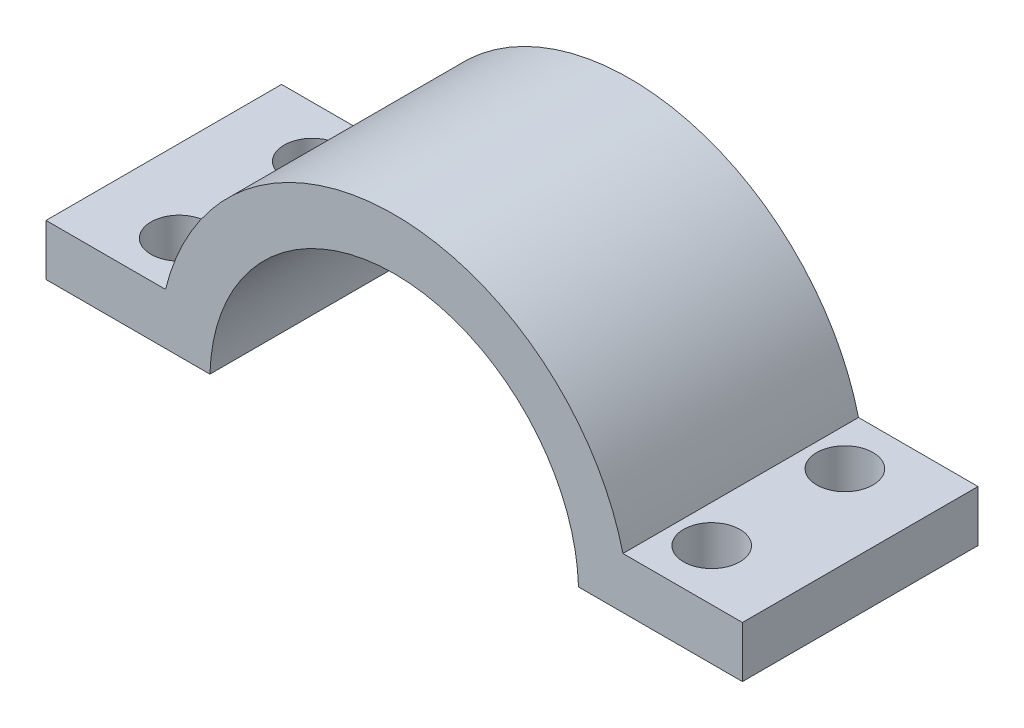
ISO-10303-21;
HEADER;
FILE_DESCRIPTION(('STEP AP214'),'2;1');
FILE_NAME('part.step','',(''),(''),'','','');
FILE_SCHEMA(('AUTOMOTIVE_DESIGN { 1 0 10303 214 1 1 1 1 }'));
ENDSEC;
DATA;
#1=APPLICATION_CONTEXT('core data for automotive mechanical design processes');
#2=APPLICATION_PROTOCOL_DEFINITION('international standard','automotive_design',2000,#1);
#3=PRODUCT_CONTEXT('',#1,'mechanical');
#4=PRODUCT('Part','Part','',(#3));
#5=PRODUCT_RELATED_PRODUCT_CATEGORY('part','',(#4));
#6=PRODUCT_DEFINITION_FORMATION('','',#4);
#7=PRODUCT_DEFINITION_CONTEXT('part definition',#1,'design');
#8=PRODUCT_DEFINITION('design','',#6,#7);
#9=PRODUCT_DEFINITION_SHAPE('','',#8);
#10=(LENGTH_UNIT() NAMED_UNIT(*) SI_UNIT(.MILLI.,.METRE.));
#11=(NAMED_UNIT(*) PLANE_ANGLE_UNIT() SI_UNIT($,.RADIAN.));
#12=(NAMED_UNIT(*) SI_UNIT($,.STERADIAN.) SOLID_ANGLE_UNIT());
#13=UNCERTAINTY_MEASURE_WITH_UNIT(LENGTH_MEASURE(1.E-05),#10,'distance_accuracy_value','');
#14=(GEOMETRIC_REPRESENTATION_CONTEXT(3) GLOBAL_UNCERTAINTY_ASSIGNED_CONTEXT((#13)) GLOBAL_UNIT_ASSIGNED_CONTEXT((#10,
#11,#12)) REPRESENTATION_CONTEXT('',''));
#15=CARTESIAN_POINT('',(0.,0.,0.));
#16=DIRECTION('',(0.,0.,1.));
#17=DIRECTION('',(1.,0.,0.));
#18=AXIS2_PLACEMENT_3D('',#15,#16,#17);
#19=CARTESIAN_POINT('',(0.,0.,23.));
#20=DIRECTION('',(0.,0.,-1.));
#21=DIRECTION('',(-1.,0.,0.));
#22=AXIS2_PLACEMENT_3D('',#19,#20,#21);
#23=CYLINDRICAL_SURFACE('',#22,18.);
#24=CARTESIAN_POINT('',(0.,0.,0.));
#25=DIRECTION('',(0.,0.,-1.));
#26=DIRECTION('',(1.,0.,0.));
#27=AXIS2_PLACEMENT_3D('',#24,#25,#26);
#28=CIRCLE('',#27,18.);
#29=CARTESIAN_POINT('',(-17.9930542154466,0.500000000000002,0.));
#30=VERTEX_POINT('',#29);
#31=CARTESIAN_POINT('',(17.9930542154466,0.500000000000002,0.));
#32=VERTEX_POINT('',#31);
#33=EDGE_CURVE('E131',#30,#32,#28,.T.);
#34=ORIENTED_EDGE('',*,*,#33,.T.);
#35=DIRECTION('',(0.,0.,-1.));
#36=VECTOR('',#35,1.);
#37=CARTESIAN_POINT('',(17.9930542154466,0.500000000000002,23.));
#38=LINE('',#37,#36);
#39=CARTESIAN_POINT('',(17.9930542154466,0.500000000000002,23.));
#40=VERTEX_POINT('',#39);
#41=EDGE_CURVE('E11',#40,#32,#38,.T.);
#42=ORIENTED_EDGE('',*,*,#41,.F.);
#43=CARTESIAN_POINT('',(0.,0.,23.));
#44=DIRECTION('',(0.,0.,-1.));
#45=DIRECTION('',(1.,0.,0.));
#46=AXIS2_PLACEMENT_3D('',#43,#44,#45);
#47=CIRCLE('',#46,18.);
#48=CARTESIAN_POINT('',(-17.9930542154466,0.500000000000002,23.));
#49=VERTEX_POINT('',#48);
#50=EDGE_CURVE('E145',#49,#40,#47,.T.);
#51=ORIENTED_EDGE('',*,*,#50,.F.);
#52=DIRECTION('',(0.,0.,-1.));
#53=VECTOR('',#52,1.);
#54=CARTESIAN_POINT('',(-17.9930542154466,0.500000000000002,23.));
#55=LINE('',#54,#53);
#56=EDGE_CURVE('E127',#49,#30,#55,.T.);
#57=ORIENTED_EDGE('',*,*,#56,.T.);
#58=EDGE_LOOP('',(#34,#42,#51,#57));
#59=FACE_BOUND('',#58,.T.);
#60=ADVANCED_FACE('F33',(#59),#23,.F.);
#61=CARTESIAN_POINT('',(17.9930542154466,0.500000000000002,23.));
#62=DIRECTION('',(0.,1.,0.));
#63=DIRECTION('',(-1.,0.,0.));
#64=AXIS2_PLACEMENT_3D('',#61,#62,#63);
#65=PLANE('',#64);
#66=CARTESIAN_POINT('',(26.,0.50000000000002,18.));
#67=DIRECTION('',(0.,-1.,0.));
#68=DIRECTION('',(1.,0.,0.));
#69=AXIS2_PLACEMENT_3D('',#66,#67,#68);
#70=CIRCLE('',#69,2.75);
#71=CARTESIAN_POINT('',(28.75,0.500000000000021,18.));
#72=VERTEX_POINT('',#71);
#73=EDGE_CURVE('E260',#72,#72,#70,.T.);
#74=ORIENTED_EDGE('',*,*,#73,.F.);
#75=EDGE_LOOP('',(#74));
#76=FACE_BOUND('',#75,.T.);
#77=CARTESIAN_POINT('',(26.,0.50000000000002,5.));
#78=DIRECTION('',(0.,-1.,0.));
#79=DIRECTION('',(1.,0.,0.));
#80=AXIS2_PLACEMENT_3D('',#77,#78,#79);
#81=CIRCLE('',#80,2.75);
#82=CARTESIAN_POINT('',(28.75,0.500000000000021,5.));
#83=VERTEX_POINT('',#82);
#84=EDGE_CURVE('E258',#83,#83,#81,.T.);
#85=ORIENTED_EDGE('',*,*,#84,.F.);
#86=EDGE_LOOP('',(#85));
#87=FACE_BOUND('',#86,.T.);
#88=DIRECTION('',(1.,0.,0.));
#89=VECTOR('',#88,1.);
#90=CARTESIAN_POINT('',(17.9930542154466,0.500000000000002,0.));
#91=LINE('',#90,#89);
#92=CARTESIAN_POINT('',(34.,0.500000000000002,0.));
#93=VERTEX_POINT('',#92);
#94=EDGE_CURVE('E134',#32,#93,#91,.T.);
#95=ORIENTED_EDGE('',*,*,#94,.T.);
#96=DIRECTION('',(0.,0.,-1.));
#97=VECTOR('',#96,1.);
#98=CARTESIAN_POINT('',(34.,0.500000000000002,23.));
#99=LINE('',#98,#97);
#100=CARTESIAN_POINT('',(34.,0.500000000000002,23.));
#101=VERTEX_POINT('',#100);
#102=EDGE_CURVE('E42',#101,#93,#99,.T.);
#103=ORIENTED_EDGE('',*,*,#102,.F.);
#104=DIRECTION('',(1.,0.,0.));
#105=VECTOR('',#104,1.);
#106=CARTESIAN_POINT('',(17.9930542154466,0.500000000000002,23.));
#107=LINE('',#106,#105);
#108=EDGE_CURVE('E94',#40,#101,#107,.T.);
#109=ORIENTED_EDGE('',*,*,#108,.F.);
#110=ORIENTED_EDGE('',*,*,#41,.T.);
#111=EDGE_LOOP('',(#95,#103,#109,#110));
#112=FACE_BOUND('',#111,.T.);
#113=ADVANCED_FACE('F208',(#76,#87,#112),#65,.F.);
#114=CARTESIAN_POINT('',(34.,0.500000000000002,23.));
#115=DIRECTION('',(-1.,0.,0.));
#116=DIRECTION('',(0.,0.,1.));
#117=AXIS2_PLACEMENT_3D('',#114,#115,#116);
#118=PLANE('',#117);
#119=DIRECTION('',(0.,1.,0.));
#120=VECTOR('',#119,1.);
#121=CARTESIAN_POINT('',(34.,0.500000000000002,0.));
#122=LINE('',#121,#120);
#123=CARTESIAN_POINT('',(34.,5.5,0.));
#124=VERTEX_POINT('',#123);
#125=EDGE_CURVE('E136',#93,#124,#122,.T.);
#126=ORIENTED_EDGE('',*,*,#125,.T.);
#127=DIRECTION('',(0.,0.,-1.));
#128=VECTOR('',#127,1.);
#129=CARTESIAN_POINT('',(34.,5.5,23.));
#130=LINE('',#129,#128);
#131=CARTESIAN_POINT('',(34.,5.5,23.));
#132=VERTEX_POINT('',#131);
#133=EDGE_CURVE('E152',#132,#124,#130,.T.);
#134=ORIENTED_EDGE('',*,*,#133,.F.);
#135=DIRECTION('',(0.,1.,0.));
#136=VECTOR('',#135,1.);
#137=CARTESIAN_POINT('',(34.,0.500000000000002,23.));
#138=LINE('',#137,#136);
#139=EDGE_CURVE('E174',#101,#132,#138,.T.);
#140=ORIENTED_EDGE('',*,*,#139,.F.);
#141=ORIENTED_EDGE('',*,*,#102,.T.);
#142=EDGE_LOOP('',(#126,#134,#140,#141));
#143=FACE_BOUND('',#142,.T.);
#144=ADVANCED_FACE('F212',(#143),#118,.F.);
#145=CARTESIAN_POINT('',(34.,5.5,23.));
#146=DIRECTION('',(0.,-1.,0.));
#147=DIRECTION('',(1.,0.,0.));
#148=AXIS2_PLACEMENT_3D('',#145,#146,#147);
#149=PLANE('',#148);
#150=CARTESIAN_POINT('',(26.,5.5,18.));
#151=DIRECTION('',(0.,-1.,0.));
#152=DIRECTION('',(1.,0.,0.));
#153=AXIS2_PLACEMENT_3D('',#150,#151,#152);
#154=CIRCLE('',#153,2.75);
#155=CARTESIAN_POINT('',(28.75,5.5,18.));
#156=VERTEX_POINT('',#155);
#157=EDGE_CURVE('E36',#156,#156,#154,.T.);
#158=ORIENTED_EDGE('',*,*,#157,.T.);
#159=EDGE_LOOP('',(#158));
#160=FACE_BOUND('',#159,.T.);
#161=CARTESIAN_POINT('',(26.,5.5,5.));
#162=DIRECTION('',(0.,-1.,0.));
#163=DIRECTION('',(1.,0.,0.));
#164=AXIS2_PLACEMENT_3D('',#161,#162,#163);
#165=CIRCLE('',#164,2.75);
#166=CARTESIAN_POINT('',(28.75,5.5,5.));
#167=VERTEX_POINT('',#166);
#168=EDGE_CURVE('E156',#167,#167,#165,.T.);
#169=ORIENTED_EDGE('',*,*,#168,.T.);
#170=EDGE_LOOP('',(#169));
#171=FACE_BOUND('',#170,.T.);
#172=DIRECTION('',(-1.,0.,0.));
#173=VECTOR('',#172,1.);
#174=CARTESIAN_POINT('',(34.,5.5,0.));
#175=LINE('',#174,#173);
#176=CARTESIAN_POINT('',(22.3327114341273,5.5,0.));
#177=VERTEX_POINT('',#176);
#178=EDGE_CURVE('E138',#124,#177,#175,.T.);
#179=ORIENTED_EDGE('',*,*,#178,.T.);
#180=DIRECTION('',(0.,0.,-1.));
#181=VECTOR('',#180,1.);
#182=CARTESIAN_POINT('',(22.3327114341273,5.5,23.));
#183=LINE('',#182,#181);
#184=CARTESIAN_POINT('',(22.3327114341273,5.5,23.));
#185=VERTEX_POINT('',#184);
#186=EDGE_CURVE('E149',#185,#177,#183,.T.);
#187=ORIENTED_EDGE('',*,*,#186,.F.);
#188=DIRECTION('',(-1.,0.,0.));
#189=VECTOR('',#188,1.);
#190=CARTESIAN_POINT('',(34.,5.5,23.));
#191=LINE('',#190,#189);
#192=EDGE_CURVE('E176',#132,#185,#191,.T.);
#193=ORIENTED_EDGE('',*,*,#192,.F.);
#194=ORIENTED_EDGE('',*,*,#133,.T.);
#195=EDGE_LOOP('',(#179,#187,#193,#194));
#196=FACE_BOUND('',#195,.T.);
#197=ADVANCED_FACE('F182',(#160,#171,#196),#149,.F.);
#198=CARTESIAN_POINT('',(0.,0.,23.));
#199=DIRECTION('',(0.,0.,-1.));
#200=DIRECTION('',(-1.,0.,0.));
#201=AXIS2_PLACEMENT_3D('',#198,#199,#200);
#202=CYLINDRICAL_SURFACE('',#201,23.);
#203=CARTESIAN_POINT('',(0.,0.,0.));
#204=DIRECTION('',(0.,0.,1.));
#205=DIRECTION('',(1.,0.,0.));
#206=AXIS2_PLACEMENT_3D('',#203,#204,#205);
#207=CIRCLE('',#206,23.);
#208=CARTESIAN_POINT('',(-22.3327114341273,5.5,0.));
#209=VERTEX_POINT('',#208);
#210=EDGE_CURVE('E140',#177,#209,#207,.T.);
#211=ORIENTED_EDGE('',*,*,#210,.T.);
#212=DIRECTION('',(0.,0.,-1.));
#213=VECTOR('',#212,1.);
#214=CARTESIAN_POINT('',(-22.3327114341273,5.5,23.));
#215=LINE('',#214,#213);
#216=CARTESIAN_POINT('',(-22.3327114341273,5.5,23.));
#217=VERTEX_POINT('',#216);
#218=EDGE_CURVE('E122',#217,#209,#215,.T.);
#219=ORIENTED_EDGE('',*,*,#218,.F.);
#220=CARTESIAN_POINT('',(0.,0.,23.));
#221=DIRECTION('',(0.,0.,1.));
#222=DIRECTION('',(1.,0.,0.));
#223=AXIS2_PLACEMENT_3D('',#220,#221,#222);
#224=CIRCLE('',#223,23.);
#225=EDGE_CURVE('E113',#185,#217,#224,.T.);
#226=ORIENTED_EDGE('',*,*,#225,.F.);
#227=ORIENTED_EDGE('',*,*,#186,.T.);
#228=EDGE_LOOP('',(#211,#219,#226,#227));
#229=FACE_BOUND('',#228,.T.);
#230=ADVANCED_FACE('F186',(#229),#202,.T.);
#231=CARTESIAN_POINT('',(-34.,5.5,23.));
#232=DIRECTION('',(0.,-1.,0.));
#233=DIRECTION('',(0.,0.,-1.));
#234=AXIS2_PLACEMENT_3D('',#231,#232,#233);
#235=PLANE('',#234);
#236=CARTESIAN_POINT('',(-26.,5.5,5.));
#237=DIRECTION('',(0.,-1.,0.));
#238=DIRECTION('',(0.,0.,-1.));
#239=AXIS2_PLACEMENT_3D('',#236,#237,#238);
#240=CIRCLE('',#239,2.75);
#241=CARTESIAN_POINT('',(-26.,5.5,2.25));
#242=VERTEX_POINT('',#241);
#243=EDGE_CURVE('E158',#242,#242,#240,.T.);
#244=ORIENTED_EDGE('',*,*,#243,.T.);
#245=EDGE_LOOP('',(#244));
#246=FACE_BOUND('',#245,.T.);
#247=CARTESIAN_POINT('',(-26.,5.5,18.));
#248=DIRECTION('',(0.,-1.,0.));
#249=DIRECTION('',(0.,0.,-1.));
#250=AXIS2_PLACEMENT_3D('',#247,#248,#249);
#251=CIRCLE('',#250,2.75);
#252=CARTESIAN_POINT('',(-26.,5.5,15.25));
#253=VERTEX_POINT('',#252);
#254=EDGE_CURVE('E163',#253,#253,#251,.T.);
#255=ORIENTED_EDGE('',*,*,#254,.T.);
#256=EDGE_LOOP('',(#255));
#257=FACE_BOUND('',#256,.T.);
#258=DIRECTION('',(-1.,0.,0.));
#259=VECTOR('',#258,1.);
#260=CARTESIAN_POINT('',(-34.,5.5,0.));
#261=LINE('',#260,#259);
#262=CARTESIAN_POINT('',(-34.,5.5,0.));
#263=VERTEX_POINT('',#262);
#264=EDGE_CURVE('E121',#209,#263,#261,.T.);
#265=ORIENTED_EDGE('',*,*,#264,.T.);
#266=DIRECTION('',(0.,0.,-1.));
#267=VECTOR('',#266,1.);
#268=CARTESIAN_POINT('',(-34.,5.5,23.));
#269=LINE('',#268,#267);
#270=CARTESIAN_POINT('',(-34.,5.5,23.));
#271=VERTEX_POINT('',#270);
#272=EDGE_CURVE('E118',#271,#263,#269,.T.);
#273=ORIENTED_EDGE('',*,*,#272,.F.);
#274=DIRECTION('',(-1.,0.,0.));
#275=VECTOR('',#274,1.);
#276=CARTESIAN_POINT('',(-34.,5.5,23.));
#277=LINE('',#276,#275);
#278=EDGE_CURVE('E107',#217,#271,#277,.T.);
#279=ORIENTED_EDGE('',*,*,#278,.F.);
#280=ORIENTED_EDGE('',*,*,#218,.T.);
#281=EDGE_LOOP('',(#265,#273,#279,#280));
#282=FACE_BOUND('',#281,.T.);
#283=ADVANCED_FACE('F119',(#246,#257,#282),#235,.F.);
#284=CARTESIAN_POINT('',(-34.,0.499999999999996,23.));
#285=DIRECTION('',(1.,0.,0.));
#286=DIRECTION('',(0.,0.,-1.));
#287=AXIS2_PLACEMENT_3D('',#284,#285,#286);
#288=PLANE('',#287);
#289=DIRECTION('',(0.,-1.,0.));
#290=VECTOR('',#289,1.);
#291=CARTESIAN_POINT('',(-34.,0.499999999999996,0.));
#292=LINE('',#291,#290);
#293=CARTESIAN_POINT('',(-34.,0.499999999999996,0.));
#294=VERTEX_POINT('',#293);
#295=EDGE_CURVE('E80',#263,#294,#292,.T.);
#296=ORIENTED_EDGE('',*,*,#295,.T.);
#297=DIRECTION('',(0.,0.,-1.));
#298=VECTOR('',#297,1.);
#299=CARTESIAN_POINT('',(-34.,0.499999999999996,23.));
#300=LINE('',#299,#298);
#301=CARTESIAN_POINT('',(-34.,0.499999999999996,23.));
#302=VERTEX_POINT('',#301);
#303=EDGE_CURVE('E123',#302,#294,#300,.T.);
#304=ORIENTED_EDGE('',*,*,#303,.F.);
#305=DIRECTION('',(0.,-1.,0.));
#306=VECTOR('',#305,1.);
#307=CARTESIAN_POINT('',(-34.,0.499999999999996,23.));
#308=LINE('',#307,#306);
#309=EDGE_CURVE('E111',#271,#302,#308,.T.);
#310=ORIENTED_EDGE('',*,*,#309,.F.);
#311=ORIENTED_EDGE('',*,*,#272,.T.);
#312=EDGE_LOOP('',(#296,#304,#310,#311));
#313=FACE_BOUND('',#312,.T.);
#314=ADVANCED_FACE('F125',(#313),#288,.F.);
#315=CARTESIAN_POINT('',(-17.9930542154466,0.500000000000002,23.));
#316=DIRECTION('',(0.,1.,0.));
#317=DIRECTION('',(-1.,0.,0.));
#318=AXIS2_PLACEMENT_3D('',#315,#316,#317);
#319=PLANE('',#318);
#320=CARTESIAN_POINT('',(-26.,0.499999999999999,5.));
#321=DIRECTION('',(0.,-1.,0.));
#322=DIRECTION('',(1.,0.,0.));
#323=AXIS2_PLACEMENT_3D('',#320,#321,#322);
#324=CIRCLE('',#323,2.75);
#325=CARTESIAN_POINT('',(-23.25,0.5,5.));
#326=VERTEX_POINT('',#325);
#327=EDGE_CURVE('E259',#326,#326,#324,.T.);
#328=ORIENTED_EDGE('',*,*,#327,.F.);
#329=EDGE_LOOP('',(#328));
#330=FACE_BOUND('',#329,.T.);
#331=CARTESIAN_POINT('',(-26.,0.499999999999999,18.));
#332=DIRECTION('',(0.,-1.,0.));
#333=DIRECTION('',(1.,0.,0.));
#334=AXIS2_PLACEMENT_3D('',#331,#332,#333);
#335=CIRCLE('',#334,2.75);
#336=CARTESIAN_POINT('',(-23.25,0.5,18.));
#337=VERTEX_POINT('',#336);
#338=EDGE_CURVE('E168',#337,#337,#335,.T.);
#339=ORIENTED_EDGE('',*,*,#338,.F.);
#340=EDGE_LOOP('',(#339));
#341=FACE_BOUND('',#340,.T.);
#342=DIRECTION('',(1.,0.,0.));
#343=VECTOR('',#342,1.);
#344=CARTESIAN_POINT('',(-17.9930542154466,0.500000000000002,0.));
#345=LINE('',#344,#343);
#346=EDGE_CURVE('E86',#294,#30,#345,.T.);
#347=ORIENTED_EDGE('',*,*,#346,.T.);
#348=ORIENTED_EDGE('',*,*,#56,.F.);
#349=DIRECTION('',(1.,0.,0.));
#350=VECTOR('',#349,1.);
#351=CARTESIAN_POINT('',(-17.9930542154466,0.500000000000002,23.));
#352=LINE('',#351,#350);
#353=EDGE_CURVE('E51',#302,#49,#352,.T.);
#354=ORIENTED_EDGE('',*,*,#353,.F.);
#355=ORIENTED_EDGE('',*,*,#303,.T.);
#356=EDGE_LOOP('',(#347,#348,#354,#355));
#357=FACE_BOUND('',#356,.T.);
#358=ADVANCED_FACE('F194',(#330,#341,#357),#319,.F.);
#359=CARTESIAN_POINT('',(0.,0.,23.));
#360=DIRECTION('',(0.,0.,1.));
#361=DIRECTION('',(1.,0.,0.));
#362=AXIS2_PLACEMENT_3D('',#359,#360,#361);
#363=PLANE('',#362);
#364=ORIENTED_EDGE('',*,*,#50,.T.);
#365=ORIENTED_EDGE('',*,*,#108,.T.);
#366=ORIENTED_EDGE('',*,*,#139,.T.);
#367=ORIENTED_EDGE('',*,*,#192,.T.);
#368=ORIENTED_EDGE('',*,*,#225,.T.);
#369=ORIENTED_EDGE('',*,*,#278,.T.);
#370=ORIENTED_EDGE('',*,*,#309,.T.);
#371=ORIENTED_EDGE('',*,*,#353,.T.);
#372=EDGE_LOOP('',(#364,#365,#366,#367,#368,#369,#370,#371));
#373=FACE_BOUND('',#372,.T.);
#374=ADVANCED_FACE('F109',(#373),#363,.T.);
#375=CARTESIAN_POINT('',(0.,0.,0.));
#376=DIRECTION('',(0.,0.,1.));
#377=DIRECTION('',(1.,0.,0.));
#378=AXIS2_PLACEMENT_3D('',#375,#376,#377);
#379=PLANE('',#378);
#380=ORIENTED_EDGE('',*,*,#33,.F.);
#381=ORIENTED_EDGE('',*,*,#346,.F.);
#382=ORIENTED_EDGE('',*,*,#295,.F.);
#383=ORIENTED_EDGE('',*,*,#264,.F.);
#384=ORIENTED_EDGE('',*,*,#210,.F.);
#385=ORIENTED_EDGE('',*,*,#178,.F.);
#386=ORIENTED_EDGE('',*,*,#125,.F.);
#387=ORIENTED_EDGE('',*,*,#94,.F.);
#388=EDGE_LOOP('',(#380,#381,#382,#383,#384,#385,#386,#387));
#389=FACE_BOUND('',#388,.T.);
#390=ADVANCED_FACE('F189',(#389),#379,.F.);
#391=CARTESIAN_POINT('',(-26.,23.,18.));
#392=DIRECTION('',(0.,-1.,0.));
#393=DIRECTION('',(1.,0.,0.));
#394=AXIS2_PLACEMENT_3D('',#391,#392,#393);
#395=CYLINDRICAL_SURFACE('',#394,2.75);
#396=ORIENTED_EDGE('',*,*,#338,.T.);
#397=EDGE_LOOP('',(#396));
#398=FACE_BOUND('',#397,.T.);
#399=ORIENTED_EDGE('',*,*,#254,.F.);
#400=EDGE_LOOP('',(#399));
#401=FACE_BOUND('',#400,.T.);
#402=ADVANCED_FACE('F233',(#398,#401),#395,.F.);
#403=CARTESIAN_POINT('',(-26.,23.,5.));
#404=DIRECTION('',(0.,-1.,0.));
#405=DIRECTION('',(1.,0.,0.));
#406=AXIS2_PLACEMENT_3D('',#403,#404,#405);
#407=CYLINDRICAL_SURFACE('',#406,2.75);
#408=ORIENTED_EDGE('',*,*,#327,.T.);
#409=EDGE_LOOP('',(#408));
#410=FACE_BOUND('',#409,.T.);
#411=ORIENTED_EDGE('',*,*,#243,.F.);
#412=EDGE_LOOP('',(#411));
#413=FACE_BOUND('',#412,.T.);
#414=ADVANCED_FACE('F235',(#410,#413),#407,.F.);
#415=CARTESIAN_POINT('',(26.,23.,5.));
#416=DIRECTION('',(0.,-1.,0.));
#417=DIRECTION('',(1.,0.,0.));
#418=AXIS2_PLACEMENT_3D('',#415,#416,#417);
#419=CYLINDRICAL_SURFACE('',#418,2.75);
#420=ORIENTED_EDGE('',*,*,#84,.T.);
#421=EDGE_LOOP('',(#420));
#422=FACE_BOUND('',#421,.T.);
#423=ORIENTED_EDGE('',*,*,#168,.F.);
#424=EDGE_LOOP('',(#423));
#425=FACE_BOUND('',#424,.T.);
#426=ADVANCED_FACE('F242',(#422,#425),#419,.F.);
#427=CARTESIAN_POINT('',(26.,23.,18.));
#428=DIRECTION('',(0.,-1.,0.));
#429=DIRECTION('',(1.,0.,0.));
#430=AXIS2_PLACEMENT_3D('',#427,#428,#429);
#431=CYLINDRICAL_SURFACE('',#430,2.75);
#432=ORIENTED_EDGE('',*,*,#73,.T.);
#433=EDGE_LOOP('',(#432));
#434=FACE_BOUND('',#433,.T.);
#435=ORIENTED_EDGE('',*,*,#157,.F.);
#436=EDGE_LOOP('',(#435));
#437=FACE_BOUND('',#436,.T.);
#438=ADVANCED_FACE('F247',(#434,#437),#431,.F.);
#439=CLOSED_SHELL('',(#60,#113,#144,#197,#230,#283,#314,#358,#374,#390,#402,#414,#426,#438));
#440=MANIFOLD_SOLID_BREP('B2',#439);
#441=ADVANCED_BREP_SHAPE_REPRESENTATION('',(#18,#440),#14);
#442=SHAPE_DEFINITION_REPRESENTATION(#9,#441);
ENDSEC;
END-ISO-10303-21;
